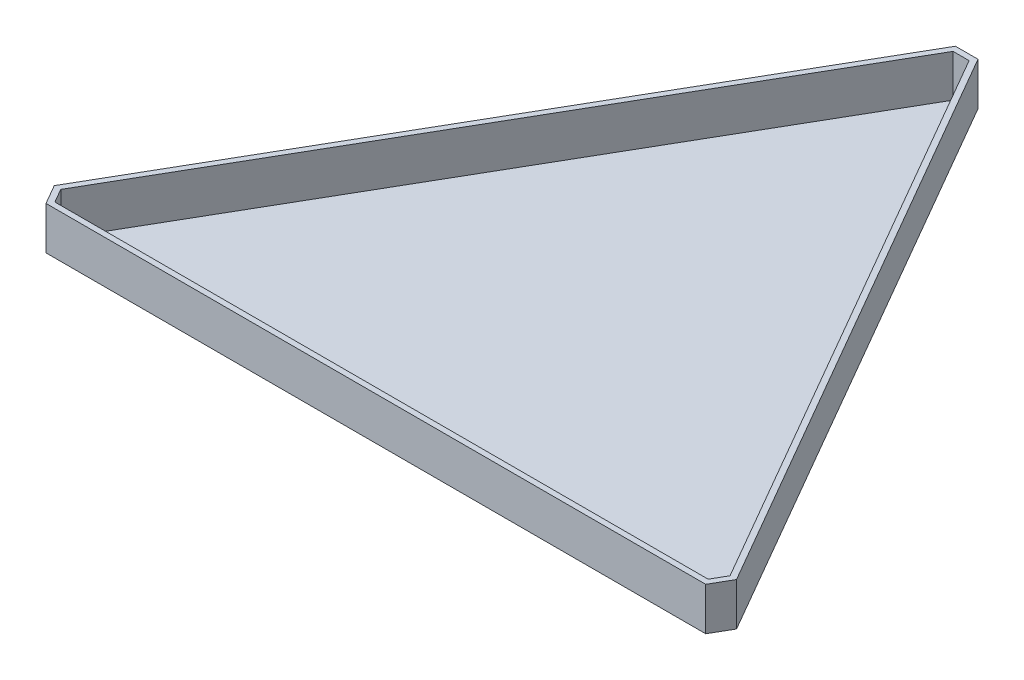
ISO-10303-21;
HEADER;
FILE_DESCRIPTION(('STEP AP214'),'2;1');
FILE_NAME('part.step','',(''),(''),'','','');
FILE_SCHEMA(('AUTOMOTIVE_DESIGN { 1 0 10303 214 1 1 1 1 }'));
ENDSEC;
DATA;
#1=APPLICATION_CONTEXT('core data for automotive mechanical design processes');
#2=APPLICATION_PROTOCOL_DEFINITION('international standard','automotive_design',2000,#1);
#3=PRODUCT_CONTEXT('',#1,'mechanical');
#4=PRODUCT('Part','Part','',(#3));
#5=PRODUCT_RELATED_PRODUCT_CATEGORY('part','',(#4));
#6=PRODUCT_DEFINITION_FORMATION('','',#4);
#7=PRODUCT_DEFINITION_CONTEXT('part definition',#1,'design');
#8=PRODUCT_DEFINITION('design','',#6,#7);
#9=PRODUCT_DEFINITION_SHAPE('','',#8);
#10=(LENGTH_UNIT() NAMED_UNIT(*) SI_UNIT(.MILLI.,.METRE.));
#11=(NAMED_UNIT(*) PLANE_ANGLE_UNIT() SI_UNIT($,.RADIAN.));
#12=(NAMED_UNIT(*) SI_UNIT($,.STERADIAN.) SOLID_ANGLE_UNIT());
#13=UNCERTAINTY_MEASURE_WITH_UNIT(LENGTH_MEASURE(1.E-05),#10,'distance_accuracy_value','');
#14=(GEOMETRIC_REPRESENTATION_CONTEXT(3) GLOBAL_UNCERTAINTY_ASSIGNED_CONTEXT((#13)) GLOBAL_UNIT_ASSIGNED_CONTEXT((#10,
#11,#12)) REPRESENTATION_CONTEXT('',''));
#15=CARTESIAN_POINT('',(0.,0.,0.));
#16=DIRECTION('',(0.,0.,1.));
#17=DIRECTION('',(1.,0.,0.));
#18=AXIS2_PLACEMENT_3D('',#15,#16,#17);
#19=CARTESIAN_POINT('',(343.272757546418,0.2,-67.6654990750007));
#20=DIRECTION('',(0.,0.,-1.));
#21=DIRECTION('',(-1.,0.,0.));
#22=AXIS2_PLACEMENT_3D('',#19,#20,#21);
#23=PLANE('',#22);
#24=DIRECTION('',(1.,0.,0.));
#25=VECTOR('',#24,1.);
#26=CARTESIAN_POINT('',(343.272757546418,0.,-67.6654990750007));
#27=LINE('',#26,#25);
#28=CARTESIAN_POINT('',(343.272757546418,0.,-67.6654990750007));
#29=VERTEX_POINT('',#28);
#30=CARTESIAN_POINT('',(351.272917769317,0.,-67.6654990750007));
#31=VERTEX_POINT('',#30);
#32=EDGE_CURVE('E198',#29,#31,#27,.T.);
#33=ORIENTED_EDGE('',*,*,#32,.F.);
#34=DIRECTION('',(0.,-1.,0.));
#35=VECTOR('',#34,1.);
#36=CARTESIAN_POINT('',(343.272757546418,0.2,-67.6654990750007));
#37=LINE('',#36,#35);
#38=CARTESIAN_POINT('',(343.272757546418,15.2,-67.6654990750007));
#39=VERTEX_POINT('',#38);
#40=EDGE_CURVE('E11',#39,#29,#37,.T.);
#41=ORIENTED_EDGE('',*,*,#40,.F.);
#42=DIRECTION('',(-1.,0.,0.));
#43=VECTOR('',#42,1.);
#44=CARTESIAN_POINT('',(343.272757546418,15.2,-67.6654990750007));
#45=LINE('',#44,#43);
#46=CARTESIAN_POINT('',(351.272917769317,15.2,-67.6654990750007));
#47=VERTEX_POINT('',#46);
#48=EDGE_CURVE('E174',#47,#39,#45,.T.);
#49=ORIENTED_EDGE('',*,*,#48,.F.);
#50=DIRECTION('',(0.,-1.,0.));
#51=VECTOR('',#50,1.);
#52=CARTESIAN_POINT('',(351.272917769317,0.2,-67.6654990750007));
#53=LINE('',#52,#51);
#54=EDGE_CURVE('E36',#47,#31,#53,.T.);
#55=ORIENTED_EDGE('',*,*,#54,.T.);
#56=EDGE_LOOP('',(#33,#41,#49,#55));
#57=FACE_BOUND('',#56,.T.);
#58=ADVANCED_FACE('F33',(#57),#23,.T.);
#59=CARTESIAN_POINT('',(226.272682948801,0.2,134.984246140569));
#60=DIRECTION('',(-0.866025052847215,0.,-0.500000607840609));
#61=DIRECTION('',(-0.500000607840609,0.,0.866025052847215));
#62=AXIS2_PLACEMENT_3D('',#59,#60,#61);
#63=PLANE('',#62);
#64=DIRECTION('',(0.500000607840609,0.,-0.866025052847215));
#65=VECTOR('',#64,1.);
#66=CARTESIAN_POINT('',(226.272682948801,0.,134.984246140569));
#67=LINE('',#66,#65);
#68=CARTESIAN_POINT('',(226.272682948801,0.,134.984246140569));
#69=VERTEX_POINT('',#68);
#70=EDGE_CURVE('E213',#69,#29,#67,.T.);
#71=ORIENTED_EDGE('',*,*,#70,.F.);
#72=DIRECTION('',(0.,-1.,0.));
#73=VECTOR('',#72,1.);
#74=CARTESIAN_POINT('',(226.272682948801,0.2,134.984246140569));
#75=LINE('',#74,#73);
#76=CARTESIAN_POINT('',(226.272682948801,15.2,134.984246140569));
#77=VERTEX_POINT('',#76);
#78=EDGE_CURVE('E41',#77,#69,#75,.T.);
#79=ORIENTED_EDGE('',*,*,#78,.F.);
#80=DIRECTION('',(-0.500000607840609,0.,0.866025052847215));
#81=VECTOR('',#80,1.);
#82=CARTESIAN_POINT('',(226.272682948801,15.2,134.984246140569));
#83=LINE('',#82,#81);
#84=EDGE_CURVE('E177',#39,#77,#83,.T.);
#85=ORIENTED_EDGE('',*,*,#84,.F.);
#86=ORIENTED_EDGE('',*,*,#40,.T.);
#87=EDGE_LOOP('',(#71,#79,#85,#86));
#88=FACE_BOUND('',#87,.T.);
#89=ADVANCED_FACE('F232',(#88),#63,.T.);
#90=CARTESIAN_POINT('',(230.273290915147,0.2,141.912373829124));
#91=DIRECTION('',(-0.865990134859403,0.,0.50006108259511));
#92=DIRECTION('',(0.50006108259511,0.,0.865990134859403));
#93=AXIS2_PLACEMENT_3D('',#90,#91,#92);
#94=PLANE('',#93);
#95=DIRECTION('',(-0.50006108259511,0.,-0.865990134859403));
#96=VECTOR('',#95,1.);
#97=CARTESIAN_POINT('',(230.273290915147,0.,141.912373829124));
#98=LINE('',#97,#96);
#99=CARTESIAN_POINT('',(230.273290915147,0.,141.912373829124));
#100=VERTEX_POINT('',#99);
#101=EDGE_CURVE('E210',#100,#69,#98,.T.);
#102=ORIENTED_EDGE('',*,*,#101,.F.);
#103=DIRECTION('',(0.,-1.,0.));
#104=VECTOR('',#103,1.);
#105=CARTESIAN_POINT('',(230.273290915147,0.2,141.912373829124));
#106=LINE('',#105,#104);
#107=CARTESIAN_POINT('',(230.273290915147,15.2,141.912373829124));
#108=VERTEX_POINT('',#107);
#109=EDGE_CURVE('E217',#108,#100,#106,.T.);
#110=ORIENTED_EDGE('',*,*,#109,.F.);
#111=DIRECTION('',(0.50006108259511,0.,0.865990134859403));
#112=VECTOR('',#111,1.);
#113=CARTESIAN_POINT('',(230.273290915147,15.2,141.912373829124));
#114=LINE('',#113,#112);
#115=EDGE_CURVE('E180',#77,#108,#114,.T.);
#116=ORIENTED_EDGE('',*,*,#115,.F.);
#117=ORIENTED_EDGE('',*,*,#78,.T.);
#118=EDGE_LOOP('',(#102,#110,#116,#117));
#119=FACE_BOUND('',#118,.T.);
#120=ADVANCED_FACE('F237',(#119),#94,.T.);
#121=CARTESIAN_POINT('',(230.273290915147,0.2,141.912373829124));
#122=DIRECTION('',(0.,0.,-1.));
#123=DIRECTION('',(-1.,0.,0.));
#124=AXIS2_PLACEMENT_3D('',#121,#122,#123);
#125=PLANE('',#124);
#126=DIRECTION('',(1.,0.,0.));
#127=VECTOR('',#126,1.);
#128=CARTESIAN_POINT('',(230.273290915147,0.,141.912373829124));
#129=LINE('',#128,#127);
#130=CARTESIAN_POINT('',(464.273241085033,0.,141.912373829124));
#131=VERTEX_POINT('',#130);
#132=EDGE_CURVE('E207',#100,#131,#129,.T.);
#133=ORIENTED_EDGE('',*,*,#132,.T.);
#134=DIRECTION('',(0.,-1.,0.));
#135=VECTOR('',#134,1.);
#136=CARTESIAN_POINT('',(464.273241085033,0.2,141.912373829124));
#137=LINE('',#136,#135);
#138=CARTESIAN_POINT('',(464.273241085033,15.2,141.912373829124));
#139=VERTEX_POINT('',#138);
#140=EDGE_CURVE('E219',#139,#131,#137,.T.);
#141=ORIENTED_EDGE('',*,*,#140,.F.);
#142=DIRECTION('',(1.,0.,0.));
#143=VECTOR('',#142,1.);
#144=CARTESIAN_POINT('',(230.273290915147,15.2,141.912373829124));
#145=LINE('',#144,#143);
#146=EDGE_CURVE('E138',#108,#139,#145,.T.);
#147=ORIENTED_EDGE('',*,*,#146,.F.);
#148=ORIENTED_EDGE('',*,*,#109,.T.);
#149=EDGE_LOOP('',(#133,#141,#147,#148));
#150=FACE_BOUND('',#149,.T.);
#151=ADVANCED_FACE('F239',(#150),#125,.F.);
#152=CARTESIAN_POINT('',(468.273000095712,0.2,134.984588004057));
#153=DIRECTION('',(0.866025403801281,0.,0.499999999970827));
#154=DIRECTION('',(0.499999999970827,0.,-0.866025403801282));
#155=AXIS2_PLACEMENT_3D('',#152,#153,#154);
#156=PLANE('',#155);
#157=DIRECTION('',(-0.499999999970827,0.,0.866025403801281));
#158=VECTOR('',#157,1.);
#159=CARTESIAN_POINT('',(468.273000095712,0.,134.984588004057));
#160=LINE('',#159,#158);
#161=CARTESIAN_POINT('',(468.273000095712,0.,134.984588004057));
#162=VERTEX_POINT('',#161);
#163=EDGE_CURVE('E204',#162,#131,#160,.T.);
#164=ORIENTED_EDGE('',*,*,#163,.F.);
#165=DIRECTION('',(0.,-1.,0.));
#166=VECTOR('',#165,1.);
#167=CARTESIAN_POINT('',(468.273000095712,0.2,134.984588004057));
#168=LINE('',#167,#166);
#169=CARTESIAN_POINT('',(468.273000095712,15.2,134.984588004057));
#170=VERTEX_POINT('',#169);
#171=EDGE_CURVE('E220',#170,#162,#168,.T.);
#172=ORIENTED_EDGE('',*,*,#171,.F.);
#173=DIRECTION('',(0.499999999970827,0.,-0.866025403801281));
#174=VECTOR('',#173,1.);
#175=CARTESIAN_POINT('',(468.273000095712,15.2,134.984588004057));
#176=LINE('',#175,#174);
#177=EDGE_CURVE('E168',#139,#170,#176,.T.);
#178=ORIENTED_EDGE('',*,*,#177,.F.);
#179=ORIENTED_EDGE('',*,*,#140,.T.);
#180=EDGE_LOOP('',(#164,#172,#178,#179));
#181=FACE_BOUND('',#180,.T.);
#182=ADVANCED_FACE('F241',(#181),#156,.T.);
#183=CARTESIAN_POINT('',(351.272917769317,0.2,-67.6654990750007));
#184=DIRECTION('',(0.866025403784439,0.,-0.5));
#185=DIRECTION('',(-0.5,0.,-0.866025403784439));
#186=AXIS2_PLACEMENT_3D('',#183,#184,#185);
#187=PLANE('',#186);
#188=DIRECTION('',(0.5,0.,0.866025403784439));
#189=VECTOR('',#188,1.);
#190=CARTESIAN_POINT('',(351.272917769317,0.,-67.6654990750007));
#191=LINE('',#190,#189);
#192=EDGE_CURVE('E201',#31,#162,#191,.T.);
#193=ORIENTED_EDGE('',*,*,#192,.F.);
#194=ORIENTED_EDGE('',*,*,#54,.F.);
#195=DIRECTION('',(-0.5,0.,-0.866025403784439));
#196=VECTOR('',#195,1.);
#197=CARTESIAN_POINT('',(351.272917769317,15.2,-67.6654990750007));
#198=LINE('',#197,#196);
#199=EDGE_CURVE('E171',#170,#47,#198,.T.);
#200=ORIENTED_EDGE('',*,*,#199,.F.);
#201=ORIENTED_EDGE('',*,*,#171,.T.);
#202=EDGE_LOOP('',(#193,#194,#200,#201));
#203=FACE_BOUND('',#202,.T.);
#204=ADVANCED_FACE('F227',(#203),#187,.T.);
#205=CARTESIAN_POINT('',(0.,0.,0.));
#206=DIRECTION('',(0.,-1.,0.));
#207=DIRECTION('',(0.,0.,-1.));
#208=AXIS2_PLACEMENT_3D('',#205,#206,#207);
#209=PLANE('',#208);
#210=ORIENTED_EDGE('',*,*,#32,.T.);
#211=ORIENTED_EDGE('',*,*,#192,.T.);
#212=ORIENTED_EDGE('',*,*,#163,.T.);
#213=ORIENTED_EDGE('',*,*,#132,.F.);
#214=ORIENTED_EDGE('',*,*,#101,.T.);
#215=ORIENTED_EDGE('',*,*,#70,.T.);
#216=EDGE_LOOP('',(#210,#211,#212,#213,#214,#215));
#217=FACE_BOUND('',#216,.T.);
#218=ADVANCED_FACE('F229',(#217),#209,.T.);
#219=CARTESIAN_POINT('',(231.427991453041,15.2,139.912373828765));
#220=DIRECTION('',(0.865969925114451,0.,-0.50009607956599));
#221=DIRECTION('',(-0.50009607956599,0.,-0.865969925114451));
#222=AXIS2_PLACEMENT_3D('',#219,#220,#221);
#223=PLANE('',#222);
#224=DIRECTION('',(0.50009607956599,0.,0.865969925114451));
#225=VECTOR('',#224,1.);
#226=CARTESIAN_POINT('',(112.957161017521,0.2,-65.2325580201885));
#227=LINE('',#226,#225);
#228=CARTESIAN_POINT('',(228.582007950323,0.2,134.984248571585));
#229=VERTEX_POINT('',#228);
#230=CARTESIAN_POINT('',(231.427991453041,0.200000000000004,139.912373828765));
#231=VERTEX_POINT('',#230);
#232=EDGE_CURVE('E196',#229,#231,#227,.T.);
#233=ORIENTED_EDGE('',*,*,#232,.F.);
#234=DIRECTION('',(0.,-1.,0.));
#235=VECTOR('',#234,1.);
#236=CARTESIAN_POINT('',(228.582007950323,15.2,134.984248571585));
#237=LINE('',#236,#235);
#238=CARTESIAN_POINT('',(228.582007950323,15.2,134.984248571585));
#239=VERTEX_POINT('',#238);
#240=EDGE_CURVE('E49',#239,#229,#237,.T.);
#241=ORIENTED_EDGE('',*,*,#240,.F.);
#242=DIRECTION('',(0.50009607956599,0.,0.865969925114451));
#243=VECTOR('',#242,1.);
#244=CARTESIAN_POINT('',(231.427991453041,15.2,139.912373828765));
#245=LINE('',#244,#243);
#246=CARTESIAN_POINT('',(231.427991453041,15.2,139.912373828765));
#247=VERTEX_POINT('',#246);
#248=EDGE_CURVE('E122',#239,#247,#245,.T.);
#249=ORIENTED_EDGE('',*,*,#248,.T.);
#250=DIRECTION('',(0.,-1.,0.));
#251=VECTOR('',#250,1.);
#252=CARTESIAN_POINT('',(231.427991453041,15.2,139.912373828765));
#253=LINE('',#252,#251);
#254=EDGE_CURVE('E125',#247,#231,#253,.T.);
#255=ORIENTED_EDGE('',*,*,#254,.T.);
#256=EDGE_LOOP('',(#233,#241,#249,#255));
#257=FACE_BOUND('',#256,.T.);
#258=ADVANCED_FACE('F124',(#257),#223,.T.);
#259=CARTESIAN_POINT('',(231.427991453041,15.2,139.912373828765));
#260=DIRECTION('',(2.70255197421388E-07,0.,-0.999999999999963));
#261=DIRECTION('',(-0.999999999999964,0.,-2.70255197421388E-07));
#262=AXIS2_PLACEMENT_3D('',#259,#260,#261);
#263=PLANE('',#262);
#264=DIRECTION('',(0.999999999999964,0.,2.70255197421388E-07));
#265=VECTOR('',#264,1.);
#266=CARTESIAN_POINT('',(-3.78120293077787E-05,0.2,139.912311284138));
#267=LINE('',#266,#265);
#268=CARTESIAN_POINT('',(463.118576697739,0.200000000000004,139.91243644435));
#269=VERTEX_POINT('',#268);
#270=EDGE_CURVE('E137',#231,#269,#267,.T.);
#271=ORIENTED_EDGE('',*,*,#270,.F.);
#272=ORIENTED_EDGE('',*,*,#254,.F.);
#273=DIRECTION('',(0.999999999999963,0.,2.70255197421388E-07));
#274=VECTOR('',#273,1.);
#275=CARTESIAN_POINT('',(231.427991453041,15.2,139.912373828765));
#276=LINE('',#275,#274);
#277=CARTESIAN_POINT('',(463.118576697739,15.2,139.91243644435));
#278=VERTEX_POINT('',#277);
#279=EDGE_CURVE('E130',#247,#278,#276,.T.);
#280=ORIENTED_EDGE('',*,*,#279,.T.);
#281=DIRECTION('',(0.,-1.,0.));
#282=VECTOR('',#281,1.);
#283=CARTESIAN_POINT('',(463.118576697739,15.2,139.91243644435));
#284=LINE('',#283,#282);
#285=EDGE_CURVE('E139',#278,#269,#284,.T.);
#286=ORIENTED_EDGE('',*,*,#285,.T.);
#287=EDGE_LOOP('',(#271,#272,#280,#286));
#288=FACE_BOUND('',#287,.T.);
#289=ADVANCED_FACE('F133',(#288),#263,.T.);
#290=CARTESIAN_POINT('',(465.963671321269,15.2,134.984588004057));
#291=DIRECTION('',(-0.866025403784441,0.,-0.499999999999997));
#292=DIRECTION('',(-0.499999999999997,0.,0.866025403784441));
#293=AXIS2_PLACEMENT_3D('',#290,#291,#292);
#294=PLANE('',#293);
#295=DIRECTION('',(0.499999999999997,0.,-0.866025403784441));
#296=VECTOR('',#295,1.);
#297=CARTESIAN_POINT('',(407.922794656397,0.2,235.514335303453));
#298=LINE('',#297,#296);
#299=CARTESIAN_POINT('',(465.963671321269,0.200000000000004,134.984588004057));
#300=VERTEX_POINT('',#299);
#301=EDGE_CURVE('E192',#269,#300,#298,.T.);
#302=ORIENTED_EDGE('',*,*,#301,.F.);
#303=ORIENTED_EDGE('',*,*,#285,.F.);
#304=DIRECTION('',(0.499999999999997,0.,-0.866025403784441));
#305=VECTOR('',#304,1.);
#306=CARTESIAN_POINT('',(465.963671321269,15.2,134.984588004057));
#307=LINE('',#306,#305);
#308=CARTESIAN_POINT('',(465.963671321269,15.2,134.984588004057));
#309=VERTEX_POINT('',#308);
#310=EDGE_CURVE('E144',#278,#309,#307,.T.);
#311=ORIENTED_EDGE('',*,*,#310,.T.);
#312=DIRECTION('',(0.,-1.,0.));
#313=VECTOR('',#312,1.);
#314=CARTESIAN_POINT('',(465.963671321269,15.2,134.984588004057));
#315=LINE('',#314,#313);
#316=EDGE_CURVE('E162',#309,#300,#315,.T.);
#317=ORIENTED_EDGE('',*,*,#316,.T.);
#318=EDGE_LOOP('',(#302,#303,#311,#317));
#319=FACE_BOUND('',#318,.T.);
#320=ADVANCED_FACE('F273',(#319),#294,.T.);
#321=CARTESIAN_POINT('',(350.118252434361,15.2,-65.665563332167));
#322=DIRECTION('',(-0.866025403784438,0.,0.5));
#323=DIRECTION('',(0.5,0.,0.866025403784439));
#324=AXIS2_PLACEMENT_3D('',#321,#322,#323);
#325=PLANE('',#324);
#326=DIRECTION('',(-0.5,0.,-0.866025403784439));
#327=VECTOR('',#326,1.);
#328=CARTESIAN_POINT('',(291.022712325507,0.2,-168.022041301426));
#329=LINE('',#328,#327);
#330=CARTESIAN_POINT('',(350.118252434361,0.200000000000004,-65.665563332167));
#331=VERTEX_POINT('',#330);
#332=EDGE_CURVE('E189',#300,#331,#329,.T.);
#333=ORIENTED_EDGE('',*,*,#332,.F.);
#334=ORIENTED_EDGE('',*,*,#316,.F.);
#335=DIRECTION('',(-0.5,0.,-0.866025403784439));
#336=VECTOR('',#335,1.);
#337=CARTESIAN_POINT('',(350.118252434361,15.2,-65.665563332167));
#338=LINE('',#337,#336);
#339=CARTESIAN_POINT('',(350.118252434361,15.2,-65.665563332167));
#340=VERTEX_POINT('',#339);
#341=EDGE_CURVE('E146',#309,#340,#338,.T.);
#342=ORIENTED_EDGE('',*,*,#341,.T.);
#343=DIRECTION('',(0.,-1.,0.));
#344=VECTOR('',#343,1.);
#345=CARTESIAN_POINT('',(350.118252434361,15.2,-65.665563332167));
#346=LINE('',#345,#344);
#347=EDGE_CURVE('E159',#340,#331,#346,.T.);
#348=ORIENTED_EDGE('',*,*,#347,.T.);
#349=EDGE_LOOP('',(#333,#334,#342,#348));
#350=FACE_BOUND('',#349,.T.);
#351=ADVANCED_FACE('F276',(#350),#325,.T.);
#352=CARTESIAN_POINT('',(344.427420985759,15.2,-65.665563332167));
#353=DIRECTION('',(0.,0.,1.));
#354=DIRECTION('',(1.,0.,0.));
#355=AXIS2_PLACEMENT_3D('',#352,#353,#354);
#356=PLANE('',#355);
#357=DIRECTION('',(-1.,0.,0.));
#358=VECTOR('',#357,1.);
#359=CARTESIAN_POINT('',(1.6013349937264E-13,0.2,-65.6655633321679));
#360=LINE('',#359,#358);
#361=CARTESIAN_POINT('',(344.427420985759,0.200000000000004,-65.665563332167));
#362=VERTEX_POINT('',#361);
#363=EDGE_CURVE('E186',#331,#362,#360,.T.);
#364=ORIENTED_EDGE('',*,*,#363,.F.);
#365=ORIENTED_EDGE('',*,*,#347,.F.);
#366=DIRECTION('',(-1.,0.,0.));
#367=VECTOR('',#366,1.);
#368=CARTESIAN_POINT('',(344.427420985759,15.2,-65.665563332167));
#369=LINE('',#368,#367);
#370=CARTESIAN_POINT('',(344.427420985759,15.2,-65.665563332167));
#371=VERTEX_POINT('',#370);
#372=EDGE_CURVE('E150',#340,#371,#369,.T.);
#373=ORIENTED_EDGE('',*,*,#372,.T.);
#374=DIRECTION('',(0.,-1.,0.));
#375=VECTOR('',#374,1.);
#376=CARTESIAN_POINT('',(344.427420985759,15.2,-65.665563332167));
#377=LINE('',#376,#375);
#378=EDGE_CURVE('E156',#371,#362,#377,.T.);
#379=ORIENTED_EDGE('',*,*,#378,.T.);
#380=EDGE_LOOP('',(#364,#365,#373,#379));
#381=FACE_BOUND('',#380,.T.);
#382=ADVANCED_FACE('F280',(#381),#356,.T.);
#383=CARTESIAN_POINT('',(228.582007950323,15.2,134.984248571585));
#384=DIRECTION('',(0.866025048463904,0.,0.500000615432714));
#385=DIRECTION('',(0.500000615432714,0.,-0.866025048463904));
#386=AXIS2_PLACEMENT_3D('',#383,#384,#385);
#387=PLANE('',#386);
#388=DIRECTION('',(-0.500000615432714,0.,0.866025048463904));
#389=VECTOR('',#388,1.);
#390=CARTESIAN_POINT('',(229.88630743527,0.2,132.725139302919));
#391=LINE('',#390,#389);
#392=EDGE_CURVE('E183',#362,#229,#391,.T.);
#393=ORIENTED_EDGE('',*,*,#392,.F.);
#394=ORIENTED_EDGE('',*,*,#378,.F.);
#395=DIRECTION('',(-0.500000615432714,0.,0.866025048463904));
#396=VECTOR('',#395,1.);
#397=CARTESIAN_POINT('',(228.582007950323,15.2,134.984248571585));
#398=LINE('',#397,#396);
#399=EDGE_CURVE('E153',#371,#239,#398,.T.);
#400=ORIENTED_EDGE('',*,*,#399,.T.);
#401=ORIENTED_EDGE('',*,*,#240,.T.);
#402=EDGE_LOOP('',(#393,#394,#400,#401));
#403=FACE_BOUND('',#402,.T.);
#404=ADVANCED_FACE('F268',(#403),#387,.T.);
#405=CARTESIAN_POINT('',(0.,15.2,0.));
#406=DIRECTION('',(0.,-1.,0.));
#407=DIRECTION('',(0.,0.,-1.));
#408=AXIS2_PLACEMENT_3D('',#405,#406,#407);
#409=PLANE('',#408);
#410=ORIENTED_EDGE('',*,*,#146,.T.);
#411=ORIENTED_EDGE('',*,*,#177,.T.);
#412=ORIENTED_EDGE('',*,*,#199,.T.);
#413=ORIENTED_EDGE('',*,*,#48,.T.);
#414=ORIENTED_EDGE('',*,*,#84,.T.);
#415=ORIENTED_EDGE('',*,*,#115,.T.);
#416=EDGE_LOOP('',(#410,#411,#412,#413,#414,#415));
#417=FACE_BOUND('',#416,.T.);
#418=ORIENTED_EDGE('',*,*,#248,.F.);
#419=ORIENTED_EDGE('',*,*,#399,.F.);
#420=ORIENTED_EDGE('',*,*,#372,.F.);
#421=ORIENTED_EDGE('',*,*,#341,.F.);
#422=ORIENTED_EDGE('',*,*,#310,.F.);
#423=ORIENTED_EDGE('',*,*,#279,.F.);
#424=EDGE_LOOP('',(#418,#419,#420,#421,#422,#423));
#425=FACE_BOUND('',#424,.T.);
#426=ADVANCED_FACE('F142',(#417,#425),#409,.F.);
#427=CARTESIAN_POINT('',(0.,0.2,0.));
#428=DIRECTION('',(0.,-1.,0.));
#429=DIRECTION('',(0.,0.,-1.));
#430=AXIS2_PLACEMENT_3D('',#427,#428,#429);
#431=PLANE('',#430);
#432=ORIENTED_EDGE('',*,*,#392,.T.);
#433=ORIENTED_EDGE('',*,*,#232,.T.);
#434=ORIENTED_EDGE('',*,*,#270,.T.);
#435=ORIENTED_EDGE('',*,*,#301,.T.);
#436=ORIENTED_EDGE('',*,*,#332,.T.);
#437=ORIENTED_EDGE('',*,*,#363,.T.);
#438=EDGE_LOOP('',(#432,#433,#434,#435,#436,#437));
#439=FACE_BOUND('',#438,.T.);
#440=ADVANCED_FACE('F262',(#439),#431,.F.);
#441=CLOSED_SHELL('',(#58,#89,#120,#151,#182,#204,#218,#258,#289,#320,#351,#382,#404,#426,#440));
#442=MANIFOLD_SOLID_BREP('B2',#441);
#443=ADVANCED_BREP_SHAPE_REPRESENTATION('',(#18,#442),#14);
#444=SHAPE_DEFINITION_REPRESENTATION(#9,#443);
ENDSEC;
END-ISO-10303-21;
